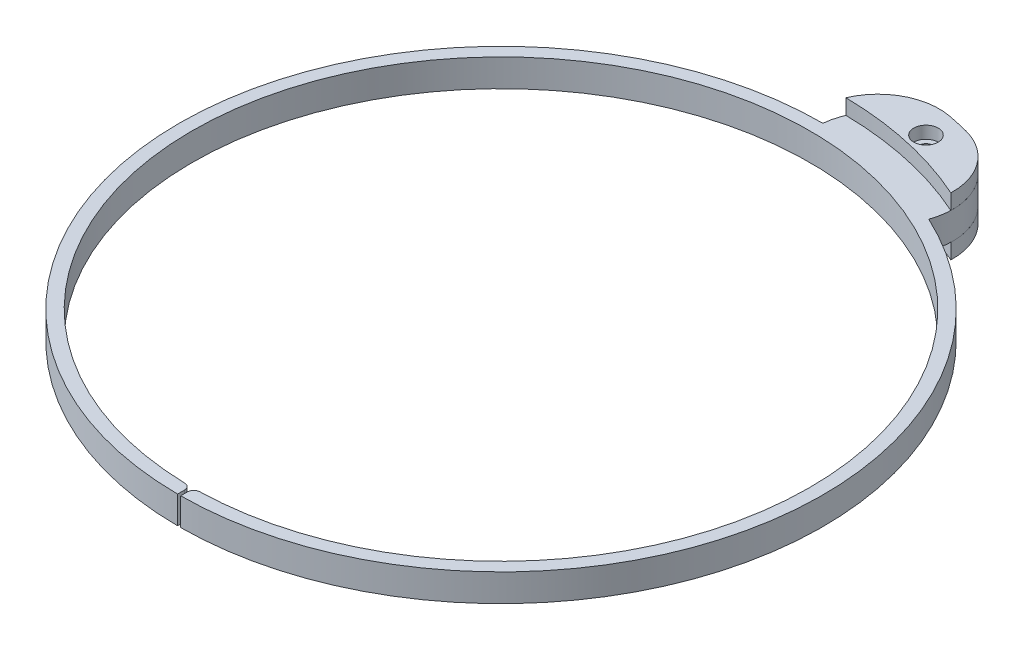
ISO-10303-21;
HEADER;
FILE_DESCRIPTION(('STEP AP214'),'2;1');
FILE_NAME('part.step','',(''),(''),'','','');
FILE_SCHEMA(('AUTOMOTIVE_DESIGN { 1 0 10303 214 1 1 1 1 }'));
ENDSEC;
DATA;
#1=APPLICATION_CONTEXT('core data for automotive mechanical design processes');
#2=APPLICATION_PROTOCOL_DEFINITION('international standard','automotive_design',2000,#1);
#3=PRODUCT_CONTEXT('',#1,'mechanical');
#4=PRODUCT('Part','Part','',(#3));
#5=PRODUCT_RELATED_PRODUCT_CATEGORY('part','',(#4));
#6=PRODUCT_DEFINITION_FORMATION('','',#4);
#7=PRODUCT_DEFINITION_CONTEXT('part definition',#1,'design');
#8=PRODUCT_DEFINITION('design','',#6,#7);
#9=PRODUCT_DEFINITION_SHAPE('','',#8);
#10=(LENGTH_UNIT() NAMED_UNIT(*) SI_UNIT(.MILLI.,.METRE.));
#11=(NAMED_UNIT(*) PLANE_ANGLE_UNIT() SI_UNIT($,.RADIAN.));
#12=(NAMED_UNIT(*) SI_UNIT($,.STERADIAN.) SOLID_ANGLE_UNIT());
#13=UNCERTAINTY_MEASURE_WITH_UNIT(LENGTH_MEASURE(1.E-05),#10,'distance_accuracy_value','');
#14=(GEOMETRIC_REPRESENTATION_CONTEXT(3) GLOBAL_UNCERTAINTY_ASSIGNED_CONTEXT((#13)) GLOBAL_UNIT_ASSIGNED_CONTEXT((#10,
#11,#12)) REPRESENTATION_CONTEXT('',''));
#15=CARTESIAN_POINT('',(0.,0.,0.));
#16=DIRECTION('',(0.,0.,1.));
#17=DIRECTION('',(1.,0.,0.));
#18=AXIS2_PLACEMENT_3D('',#15,#16,#17);
#19=CARTESIAN_POINT('',(0.,9.,0.));
#20=DIRECTION('',(0.,-1.,0.));
#21=DIRECTION('',(0.,0.,-1.));
#22=AXIS2_PLACEMENT_3D('',#19,#20,#21);
#23=CYLINDRICAL_SURFACE('',#22,105.25);
#24=CARTESIAN_POINT('',(0.,9.,0.));
#25=DIRECTION('',(0.,1.,0.));
#26=DIRECTION('',(0.,0.,1.));
#27=AXIS2_PLACEMENT_3D('',#24,#25,#26);
#28=CIRCLE('',#27,105.25);
#29=CARTESIAN_POINT('',(0.500000000000014,9.,105.248812344843));
#30=VERTEX_POINT('',#29);
#31=CARTESIAN_POINT('',(44.4805720482087,9.,-95.3888945856074));
#32=VERTEX_POINT('',#31);
#33=EDGE_CURVE('E171',#30,#32,#28,.T.);
#34=ORIENTED_EDGE('',*,*,#33,.F.);
#35=DIRECTION('',(0.,-1.,0.));
#36=VECTOR('',#35,1.);
#37=CARTESIAN_POINT('',(0.500000000000011,9.,105.248812344843));
#38=LINE('',#37,#36);
#39=CARTESIAN_POINT('',(0.500000000000011,0.,105.248812344843));
#40=VERTEX_POINT('',#39);
#41=EDGE_CURVE('E206',#30,#40,#38,.T.);
#42=ORIENTED_EDGE('',*,*,#41,.T.);
#43=CARTESIAN_POINT('',(0.,0.,0.));
#44=DIRECTION('',(0.,1.,0.));
#45=DIRECTION('',(0.,0.,1.));
#46=AXIS2_PLACEMENT_3D('',#43,#44,#45);
#47=CIRCLE('',#46,105.25);
#48=CARTESIAN_POINT('',(44.4805720482087,0.,-95.3888945856074));
#49=VERTEX_POINT('',#48);
#50=EDGE_CURVE('E184',#40,#49,#47,.T.);
#51=ORIENTED_EDGE('',*,*,#50,.T.);
#52=DIRECTION('',(0.,-1.,0.));
#53=VECTOR('',#52,1.);
#54=CARTESIAN_POINT('',(44.4805720482087,0.,-95.3888945856074));
#55=LINE('',#54,#53);
#56=EDGE_CURVE('E241',#32,#49,#55,.T.);
#57=ORIENTED_EDGE('',*,*,#56,.F.);
#58=EDGE_LOOP('',(#34,#42,#51,#57));
#59=FACE_BOUND('',#58,.T.);
#60=ADVANCED_FACE('F60',(#59),#23,.T.);
#61=CARTESIAN_POINT('',(1.53147339329584,0.,-111.239458328624));
#62=DIRECTION('',(0.,-1.,0.));
#63=DIRECTION('',(0.,0.,-1.));
#64=AXIS2_PLACEMENT_3D('',#61,#62,#63);
#65=PLANE('',#64);
#66=CARTESIAN_POINT('',(0.,0.,0.));
#67=DIRECTION('',(0.,1.,0.));
#68=DIRECTION('',(0.,0.,1.));
#69=AXIS2_PLACEMENT_3D('',#66,#67,#68);
#70=CIRCLE('',#69,101.);
#71=CARTESIAN_POINT('',(2.45145631067962,0.,100.970244933628));
#72=VERTEX_POINT('',#71);
#73=CARTESIAN_POINT('',(-2.4514563106796,0.,100.970244933628));
#74=VERTEX_POINT('',#73);
#75=EDGE_CURVE('E180',#72,#74,#70,.T.);
#76=ORIENTED_EDGE('',*,*,#75,.T.);
#77=CARTESIAN_POINT('',(-2.49999999999999,0.,102.969655724393));
#78=DIRECTION('',(0.,-1.,0.));
#79=DIRECTION('',(0.,0.,-1.));
#80=AXIS2_PLACEMENT_3D('',#77,#78,#79);
#81=CIRCLE('',#80,2.);
#82=CARTESIAN_POINT('',(-0.499999999999989,0.,102.969655724393));
#83=VERTEX_POINT('',#82);
#84=EDGE_CURVE('E69',#74,#83,#81,.T.);
#85=ORIENTED_EDGE('',*,*,#84,.T.);
#86=DIRECTION('',(0.,0.,-1.));
#87=VECTOR('',#86,1.);
#88=CARTESIAN_POINT('',(-0.499999999999989,0.,-111.239458328624));
#89=LINE('',#88,#87);
#90=CARTESIAN_POINT('',(-0.499999999999989,0.,105.248812344843));
#91=VERTEX_POINT('',#90);
#92=EDGE_CURVE('E151',#91,#83,#89,.T.);
#93=ORIENTED_EDGE('',*,*,#92,.F.);
#94=CARTESIAN_POINT('',(0.,0.,-105.25));
#95=VERTEX_POINT('',#94);
#96=EDGE_CURVE('E160',#95,#91,#47,.T.);
#97=ORIENTED_EDGE('',*,*,#96,.F.);
#98=CARTESIAN_POINT('',(19.9095227800857,0.,-103.349762470309));
#99=DIRECTION('',(0.,1.,0.));
#100=DIRECTION('',(0.,0.,1.));
#101=AXIS2_PLACEMENT_3D('',#98,#99,#100);
#102=CIRCLE('',#101,20.);
#103=CARTESIAN_POINT('',(23.6928050185818,0.,-122.988672203384));
#104=VERTEX_POINT('',#103);
#105=EDGE_CURVE('E194',#95,#104,#102,.F.);
#106=ORIENTED_EDGE('',*,*,#105,.T.);
#107=CARTESIAN_POINT('',(0.,0.,0.));
#108=DIRECTION('',(0.,-1.,0.));
#109=DIRECTION('',(0.,0.,-1.));
#110=AXIS2_PLACEMENT_3D('',#107,#108,#109);
#111=CIRCLE('',#110,125.25);
#112=CARTESIAN_POINT('',(30.5042851753092,0.,-121.478603407939));
#113=VERTEX_POINT('',#112);
#114=EDGE_CURVE('E203',#104,#113,#111,.T.);
#115=ORIENTED_EDGE('',*,*,#114,.T.);
#116=CARTESIAN_POINT('',(25.6333414347409,0.,-102.080822424636));
#117=DIRECTION('',(0.,1.,0.));
#118=DIRECTION('',(0.,0.,1.));
#119=AXIS2_PLACEMENT_3D('',#116,#117,#118);
#120=CIRCLE('',#119,20.);
#121=EDGE_CURVE('E190',#113,#49,#120,.F.);
#122=ORIENTED_EDGE('',*,*,#121,.T.);
#123=ORIENTED_EDGE('',*,*,#50,.F.);
#124=DIRECTION('',(0.,0.,1.));
#125=VECTOR('',#124,1.);
#126=CARTESIAN_POINT('',(0.500000000000011,0.,-111.239458328624));
#127=LINE('',#126,#125);
#128=CARTESIAN_POINT('',(0.500000000000011,0.,102.969655724393));
#129=VERTEX_POINT('',#128);
#130=EDGE_CURVE('E256',#129,#40,#127,.T.);
#131=ORIENTED_EDGE('',*,*,#130,.F.);
#132=CARTESIAN_POINT('',(2.50000000000001,0.,102.969655724393));
#133=DIRECTION('',(0.,-1.,0.));
#134=DIRECTION('',(0.,0.,-1.));
#135=AXIS2_PLACEMENT_3D('',#132,#133,#134);
#136=CIRCLE('',#135,2.);
#137=EDGE_CURVE('E76',#129,#72,#136,.T.);
#138=ORIENTED_EDGE('',*,*,#137,.T.);
#139=EDGE_LOOP('',(#76,#85,#93,#97,#106,#115,#122,#123,#131,#138));
#140=FACE_BOUND('',#139,.T.);
#141=CARTESIAN_POINT('',(25.2163460487392,0.,-113.743586553333));
#142=DIRECTION('',(0.,-1.,0.));
#143=DIRECTION('',(0.,0.,-1.));
#144=AXIS2_PLACEMENT_3D('',#141,#142,#143);
#145=CIRCLE('',#144,2.25);
#146=CARTESIAN_POINT('',(25.2163460487392,0.,-115.993586553333));
#147=VERTEX_POINT('',#146);
#148=EDGE_CURVE('E198',#147,#147,#145,.F.);
#149=ORIENTED_EDGE('',*,*,#148,.T.);
#150=EDGE_LOOP('',(#149));
#151=FACE_BOUND('',#150,.T.);
#152=ADVANCED_FACE('F228',(#140,#151),#65,.T.);
#153=CARTESIAN_POINT('',(25.2163460487392,14.,-113.743586553333));
#154=DIRECTION('',(0.,1.,0.));
#155=DIRECTION('',(0.,0.,1.));
#156=AXIS2_PLACEMENT_3D('',#153,#154,#155);
#157=CYLINDRICAL_SURFACE('',#156,2.25);
#158=CARTESIAN_POINT('',(25.2163460487392,9.,-113.743586553333));
#159=DIRECTION('',(0.,1.,0.));
#160=DIRECTION('',(0.,0.,1.));
#161=AXIS2_PLACEMENT_3D('',#158,#159,#160);
#162=CIRCLE('',#161,2.25);
#163=CARTESIAN_POINT('',(25.2163460487392,9.,-111.493586553333));
#164=VERTEX_POINT('',#163);
#165=EDGE_CURVE('E213',#164,#164,#162,.T.);
#166=ORIENTED_EDGE('',*,*,#165,.T.);
#167=EDGE_LOOP('',(#166));
#168=FACE_BOUND('',#167,.T.);
#169=ORIENTED_EDGE('',*,*,#148,.F.);
#170=EDGE_LOOP('',(#169));
#171=FACE_BOUND('',#170,.T.);
#172=ADVANCED_FACE('F273',(#168,#171),#157,.F.);
#173=CARTESIAN_POINT('',(0.,9.,0.));
#174=DIRECTION('',(0.,1.,0.));
#175=DIRECTION('',(0.,0.,1.));
#176=AXIS2_PLACEMENT_3D('',#173,#174,#175);
#177=CYLINDRICAL_SURFACE('',#176,125.25);
#178=ORIENTED_EDGE('',*,*,#114,.F.);
#179=DIRECTION('',(0.,1.,0.));
#180=VECTOR('',#179,1.);
#181=CARTESIAN_POINT('',(23.6928050185818,9.,-122.988672203384));
#182=LINE('',#181,#180);
#183=CARTESIAN_POINT('',(23.6928050185818,9.,-122.988672203384));
#184=VERTEX_POINT('',#183);
#185=EDGE_CURVE('E176',#104,#184,#182,.T.);
#186=ORIENTED_EDGE('',*,*,#185,.T.);
#187=CARTESIAN_POINT('',(0.,9.,0.));
#188=DIRECTION('',(0.,1.,0.));
#189=DIRECTION('',(0.,0.,1.));
#190=AXIS2_PLACEMENT_3D('',#187,#188,#189);
#191=CIRCLE('',#190,125.25);
#192=CARTESIAN_POINT('',(30.5042851753092,9.,-121.478603407939));
#193=VERTEX_POINT('',#192);
#194=EDGE_CURVE('E197',#193,#184,#191,.T.);
#195=ORIENTED_EDGE('',*,*,#194,.F.);
#196=DIRECTION('',(0.,1.,0.));
#197=VECTOR('',#196,1.);
#198=CARTESIAN_POINT('',(30.5042851753092,9.,-121.478603407939));
#199=LINE('',#198,#197);
#200=EDGE_CURVE('E170',#193,#113,#199,.F.);
#201=ORIENTED_EDGE('',*,*,#200,.T.);
#202=EDGE_LOOP('',(#178,#186,#195,#201));
#203=FACE_BOUND('',#202,.T.);
#204=ADVANCED_FACE('F282',(#203),#177,.T.);
#205=CARTESIAN_POINT('',(19.9095227800857,9.,-103.349762470309));
#206=DIRECTION('',(0.,-1.,0.));
#207=DIRECTION('',(0.,0.,-1.));
#208=AXIS2_PLACEMENT_3D('',#205,#206,#207);
#209=CYLINDRICAL_SURFACE('',#208,20.);
#210=ORIENTED_EDGE('',*,*,#185,.F.);
#211=ORIENTED_EDGE('',*,*,#105,.F.);
#212=DIRECTION('',(0.,-1.,0.));
#213=VECTOR('',#212,1.);
#214=CARTESIAN_POINT('',(0.,0.,-105.25));
#215=LINE('',#214,#213);
#216=CARTESIAN_POINT('',(0.,9.,-105.25));
#217=VERTEX_POINT('',#216);
#218=EDGE_CURVE('E202',#217,#95,#215,.T.);
#219=ORIENTED_EDGE('',*,*,#218,.F.);
#220=CARTESIAN_POINT('',(19.9095227800857,9.,-103.349762470309));
#221=DIRECTION('',(0.,1.,0.));
#222=DIRECTION('',(0.,0.,1.));
#223=AXIS2_PLACEMENT_3D('',#220,#221,#222);
#224=CIRCLE('',#223,20.);
#225=EDGE_CURVE('E168',#184,#217,#224,.T.);
#226=ORIENTED_EDGE('',*,*,#225,.F.);
#227=EDGE_LOOP('',(#210,#211,#219,#226));
#228=FACE_BOUND('',#227,.T.);
#229=ADVANCED_FACE('F288',(#228),#209,.T.);
#230=CARTESIAN_POINT('',(25.6333414347409,9.,-102.080822424636));
#231=DIRECTION('',(0.,-1.,0.));
#232=DIRECTION('',(0.,0.,-1.));
#233=AXIS2_PLACEMENT_3D('',#230,#231,#232);
#234=CYLINDRICAL_SURFACE('',#233,20.);
#235=ORIENTED_EDGE('',*,*,#121,.F.);
#236=ORIENTED_EDGE('',*,*,#200,.F.);
#237=CARTESIAN_POINT('',(25.6333414347409,9.,-102.080822424636));
#238=DIRECTION('',(0.,1.,0.));
#239=DIRECTION('',(0.,0.,1.));
#240=AXIS2_PLACEMENT_3D('',#237,#238,#239);
#241=CIRCLE('',#240,20.);
#242=EDGE_CURVE('E185',#32,#193,#241,.T.);
#243=ORIENTED_EDGE('',*,*,#242,.F.);
#244=ORIENTED_EDGE('',*,*,#56,.T.);
#245=EDGE_LOOP('',(#235,#236,#243,#244));
#246=FACE_BOUND('',#245,.T.);
#247=ADVANCED_FACE('F280',(#246),#234,.T.);
#248=CARTESIAN_POINT('',(45.6238402538365,9.,-101.464415932347));
#249=DIRECTION('',(0.,1.,0.));
#250=DIRECTION('',(0.,0.,1.));
#251=AXIS2_PLACEMENT_3D('',#248,#249,#250);
#252=PLANE('',#251);
#253=DIRECTION('',(0.,0.,1.));
#254=VECTOR('',#253,1.);
#255=CARTESIAN_POINT('',(-0.499999999999987,9.,-101.464415932347));
#256=LINE('',#255,#254);
#257=CARTESIAN_POINT('',(-0.499999999999987,9.,102.969655724393));
#258=VERTEX_POINT('',#257);
#259=CARTESIAN_POINT('',(-0.499999999999987,9.,105.248812344843));
#260=VERTEX_POINT('',#259);
#261=EDGE_CURVE('E140',#258,#260,#256,.T.);
#262=ORIENTED_EDGE('',*,*,#261,.F.);
#263=CARTESIAN_POINT('',(-2.49999999999999,9.,102.969655724393));
#264=DIRECTION('',(0.,1.,0.));
#265=DIRECTION('',(0.,0.,1.));
#266=AXIS2_PLACEMENT_3D('',#263,#264,#265);
#267=CIRCLE('',#266,2.);
#268=CARTESIAN_POINT('',(-2.4514563106796,9.,100.970244933628));
#269=VERTEX_POINT('',#268);
#270=EDGE_CURVE('E216',#258,#269,#267,.T.);
#271=ORIENTED_EDGE('',*,*,#270,.T.);
#272=CARTESIAN_POINT('',(0.,9.,0.));
#273=DIRECTION('',(0.,1.,0.));
#274=DIRECTION('',(0.,0.,1.));
#275=AXIS2_PLACEMENT_3D('',#272,#273,#274);
#276=CIRCLE('',#275,101.);
#277=CARTESIAN_POINT('',(2.45145631067962,9.,100.970244933628));
#278=VERTEX_POINT('',#277);
#279=EDGE_CURVE('E235',#278,#269,#276,.T.);
#280=ORIENTED_EDGE('',*,*,#279,.F.);
#281=CARTESIAN_POINT('',(2.50000000000001,9.,102.969655724393));
#282=DIRECTION('',(0.,1.,0.));
#283=DIRECTION('',(0.,0.,1.));
#284=AXIS2_PLACEMENT_3D('',#281,#282,#283);
#285=CIRCLE('',#284,2.);
#286=CARTESIAN_POINT('',(0.500000000000014,9.,102.969655724393));
#287=VERTEX_POINT('',#286);
#288=EDGE_CURVE('E212',#278,#287,#285,.T.);
#289=ORIENTED_EDGE('',*,*,#288,.T.);
#290=DIRECTION('',(0.,0.,-1.));
#291=VECTOR('',#290,1.);
#292=CARTESIAN_POINT('',(0.500000000000014,9.,-101.464415932347));
#293=LINE('',#292,#291);
#294=EDGE_CURVE('E162',#30,#287,#293,.T.);
#295=ORIENTED_EDGE('',*,*,#294,.F.);
#296=ORIENTED_EDGE('',*,*,#33,.T.);
#297=ORIENTED_EDGE('',*,*,#242,.T.);
#298=ORIENTED_EDGE('',*,*,#194,.T.);
#299=ORIENTED_EDGE('',*,*,#225,.T.);
#300=EDGE_CURVE('E157',#217,#260,#28,.T.);
#301=ORIENTED_EDGE('',*,*,#300,.T.);
#302=EDGE_LOOP('',(#262,#271,#280,#289,#295,#296,#297,#298,#299,#301));
#303=FACE_BOUND('',#302,.T.);
#304=ORIENTED_EDGE('',*,*,#165,.F.);
#305=EDGE_LOOP('',(#304));
#306=FACE_BOUND('',#305,.T.);
#307=ADVANCED_FACE('F164',(#303,#306),#252,.T.);
#308=ORIENTED_EDGE('',*,*,#96,.T.);
#309=DIRECTION('',(0.,-1.,0.));
#310=VECTOR('',#309,1.);
#311=CARTESIAN_POINT('',(-0.499999999999989,9.,105.248812344843));
#312=LINE('',#311,#310);
#313=EDGE_CURVE('E144',#91,#260,#312,.F.);
#314=ORIENTED_EDGE('',*,*,#313,.T.);
#315=ORIENTED_EDGE('',*,*,#300,.F.);
#316=ORIENTED_EDGE('',*,*,#218,.T.);
#317=EDGE_LOOP('',(#308,#314,#315,#316));
#318=FACE_BOUND('',#317,.T.);
#319=ADVANCED_FACE('F156',(#318),#23,.T.);
#320=CARTESIAN_POINT('',(0.,9.,0.));
#321=DIRECTION('',(0.,-1.,0.));
#322=DIRECTION('',(0.,0.,-1.));
#323=AXIS2_PLACEMENT_3D('',#320,#321,#322);
#324=CYLINDRICAL_SURFACE('',#323,101.);
#325=ORIENTED_EDGE('',*,*,#279,.T.);
#326=DIRECTION('',(0.,-1.,0.));
#327=VECTOR('',#326,1.);
#328=CARTESIAN_POINT('',(-2.4514563106796,9.,100.970244933628));
#329=LINE('',#328,#327);
#330=EDGE_CURVE('E83',#269,#74,#329,.T.);
#331=ORIENTED_EDGE('',*,*,#330,.T.);
#332=ORIENTED_EDGE('',*,*,#75,.F.);
#333=DIRECTION('',(0.,-1.,0.));
#334=VECTOR('',#333,1.);
#335=CARTESIAN_POINT('',(2.45145631067962,9.,100.970244933628));
#336=LINE('',#335,#334);
#337=EDGE_CURVE('E219',#72,#278,#336,.F.);
#338=ORIENTED_EDGE('',*,*,#337,.T.);
#339=EDGE_LOOP('',(#325,#331,#332,#338));
#340=FACE_BOUND('',#339,.T.);
#341=ADVANCED_FACE('F237',(#340),#324,.F.);
#342=CARTESIAN_POINT('',(-0.499999999999989,-5.,116.112866457982));
#343=DIRECTION('',(-1.,0.,0.));
#344=DIRECTION('',(0.,0.,1.));
#345=AXIS2_PLACEMENT_3D('',#342,#343,#344);
#346=PLANE('',#345);
#347=ORIENTED_EDGE('',*,*,#92,.T.);
#348=DIRECTION('',(0.,1.,0.));
#349=VECTOR('',#348,1.);
#350=CARTESIAN_POINT('',(-0.499999999999989,9.,102.969655724393));
#351=LINE('',#350,#349);
#352=EDGE_CURVE('E147',#83,#258,#351,.T.);
#353=ORIENTED_EDGE('',*,*,#352,.T.);
#354=ORIENTED_EDGE('',*,*,#261,.T.);
#355=ORIENTED_EDGE('',*,*,#313,.F.);
#356=EDGE_LOOP('',(#347,#353,#354,#355));
#357=FACE_BOUND('',#356,.T.);
#358=ADVANCED_FACE('F143',(#357),#346,.F.);
#359=CARTESIAN_POINT('',(0.500000000000011,-5.,116.112866457982));
#360=DIRECTION('',(1.,0.,0.));
#361=DIRECTION('',(0.,0.,-1.));
#362=AXIS2_PLACEMENT_3D('',#359,#360,#361);
#363=PLANE('',#362);
#364=ORIENTED_EDGE('',*,*,#294,.T.);
#365=DIRECTION('',(0.,1.,0.));
#366=VECTOR('',#365,1.);
#367=CARTESIAN_POINT('',(0.500000000000011,0.,102.969655724393));
#368=LINE('',#367,#366);
#369=EDGE_CURVE('E13',#287,#129,#368,.F.);
#370=ORIENTED_EDGE('',*,*,#369,.T.);
#371=ORIENTED_EDGE('',*,*,#130,.T.);
#372=ORIENTED_EDGE('',*,*,#41,.F.);
#373=EDGE_LOOP('',(#364,#370,#371,#372));
#374=FACE_BOUND('',#373,.T.);
#375=ADVANCED_FACE('F263',(#374),#363,.F.);
#376=CARTESIAN_POINT('',(-2.49999999999999,9.,102.969655724393));
#377=DIRECTION('',(0.,-1.,0.));
#378=DIRECTION('',(0.,0.,-1.));
#379=AXIS2_PLACEMENT_3D('',#376,#377,#378);
#380=CYLINDRICAL_SURFACE('',#379,2.);
#381=ORIENTED_EDGE('',*,*,#84,.F.);
#382=ORIENTED_EDGE('',*,*,#330,.F.);
#383=ORIENTED_EDGE('',*,*,#270,.F.);
#384=ORIENTED_EDGE('',*,*,#352,.F.);
#385=EDGE_LOOP('',(#381,#382,#383,#384));
#386=FACE_BOUND('',#385,.T.);
#387=ADVANCED_FACE('F233',(#386),#380,.T.);
#388=CARTESIAN_POINT('',(2.50000000000001,9.,102.969655724393));
#389=DIRECTION('',(0.,-1.,0.));
#390=DIRECTION('',(0.,0.,-1.));
#391=AXIS2_PLACEMENT_3D('',#388,#389,#390);
#392=CYLINDRICAL_SURFACE('',#391,2.);
#393=ORIENTED_EDGE('',*,*,#288,.F.);
#394=ORIENTED_EDGE('',*,*,#337,.F.);
#395=ORIENTED_EDGE('',*,*,#137,.F.);
#396=ORIENTED_EDGE('',*,*,#369,.F.);
#397=EDGE_LOOP('',(#393,#394,#395,#396));
#398=FACE_BOUND('',#397,.T.);
#399=ADVANCED_FACE('F62',(#398),#392,.T.);
#400=CLOSED_SHELL('',(#60,#152,#172,#204,#229,#247,#307,#319,#341,#358,#375,#387,#399));
#401=MANIFOLD_SOLID_BREP('B2',#400);
#402=CARTESIAN_POINT('',(1.53147339329584,0.,-111.239458328624));
#403=DIRECTION('',(0.,-1.,0.));
#404=DIRECTION('',(0.,0.,-1.));
#405=AXIS2_PLACEMENT_3D('',#402,#403,#404);
#406=PLANE('',#405);
#407=CARTESIAN_POINT('',(19.9095227800857,0.,-103.349762470309));
#408=DIRECTION('',(0.,-1.,0.));
#409=DIRECTION('',(0.,0.,-1.));
#410=AXIS2_PLACEMENT_3D('',#407,#408,#409);
#411=CIRCLE('',#410,20.);
#412=CARTESIAN_POINT('',(23.6928050185818,0.,-122.988672203384));
#413=VERTEX_POINT('',#412);
#414=CARTESIAN_POINT('',(1.53147339329584,0.,-111.239458328624));
#415=VERTEX_POINT('',#414);
#416=EDGE_CURVE('E674',#413,#415,#411,.F.);
#417=ORIENTED_EDGE('',*,*,#416,.T.);
#418=CARTESIAN_POINT('',(0.,0.,0.));
#419=DIRECTION('',(0.,-1.,0.));
#420=DIRECTION('',(0.,0.,-1.));
#421=AXIS2_PLACEMENT_3D('',#418,#419,#420);
#422=CIRCLE('',#421,111.25);
#423=CARTESIAN_POINT('',(45.6238402538365,0.,-101.464415932347));
#424=VERTEX_POINT('',#423);
#425=EDGE_CURVE('E58',#415,#424,#422,.T.);
#426=ORIENTED_EDGE('',*,*,#425,.T.);
#427=CARTESIAN_POINT('',(25.6333414347409,0.,-102.080822424636));
#428=DIRECTION('',(0.,-1.,0.));
#429=DIRECTION('',(0.,0.,-1.));
#430=AXIS2_PLACEMENT_3D('',#427,#428,#429);
#431=CIRCLE('',#430,20.);
#432=CARTESIAN_POINT('',(30.5042851753092,0.,-121.478603407939));
#433=VERTEX_POINT('',#432);
#434=EDGE_CURVE('E519',#424,#433,#431,.F.);
#435=ORIENTED_EDGE('',*,*,#434,.T.);
#436=CARTESIAN_POINT('',(0.,0.,0.));
#437=DIRECTION('',(0.,-1.,0.));
#438=DIRECTION('',(0.,0.,-1.));
#439=AXIS2_PLACEMENT_3D('',#436,#437,#438);
#440=CIRCLE('',#439,125.25);
#441=EDGE_CURVE('E670',#413,#433,#440,.T.);
#442=ORIENTED_EDGE('',*,*,#441,.F.);
#443=EDGE_LOOP('',(#417,#426,#435,#442));
#444=FACE_BOUND('',#443,.T.);
#445=CARTESIAN_POINT('',(25.2163460487392,0.,-113.743586553333));
#446=DIRECTION('',(0.,-1.,0.));
#447=DIRECTION('',(0.,0.,-1.));
#448=AXIS2_PLACEMENT_3D('',#445,#446,#447);
#449=CIRCLE('',#448,2.25);
#450=CARTESIAN_POINT('',(25.2163460487392,0.,-115.993586553333));
#451=VERTEX_POINT('',#450);
#452=EDGE_CURVE('E514',#451,#451,#449,.F.);
#453=ORIENTED_EDGE('',*,*,#452,.F.);
#454=EDGE_LOOP('',(#453));
#455=FACE_BOUND('',#454,.T.);
#456=ADVANCED_FACE('F511',(#444,#455),#406,.F.);
#457=CARTESIAN_POINT('',(26.9577188644581,-5.000012,-109.465625117087));
#458=DIRECTION('',(0.13659550707763,0.,-0.990626906280162));
#459=DIRECTION('',(-0.990626906280162,0.,-0.13659550707763));
#460=AXIS2_PLACEMENT_3D('',#457,#458,#459);
#461=PLANE('',#460);
#462=DIRECTION('',(0.,1.,0.));
#463=VECTOR('',#462,1.);
#464=CARTESIAN_POINT('',(22.3822091763994,-5.000012,-110.096532739338));
#465=LINE('',#464,#463);
#466=CARTESIAN_POINT('',(22.3822091763994,-5.,-110.096532739338));
#467=VERTEX_POINT('',#466);
#468=CARTESIAN_POINT('',(22.3822091763994,-2.,-110.096532739338));
#469=VERTEX_POINT('',#468);
#470=EDGE_CURVE('E631',#467,#469,#465,.T.);
#471=ORIENTED_EDGE('',*,*,#470,.T.);
#472=DIRECTION('',(-0.990626906280162,0.,-0.13659550707763));
#473=VECTOR('',#472,1.);
#474=CARTESIAN_POINT('',(26.9577188644581,-2.,-109.465625117087));
#475=LINE('',#474,#473);
#476=CARTESIAN_POINT('',(26.9577188644581,-2.,-109.465625117087));
#477=VERTEX_POINT('',#476);
#478=EDGE_CURVE('E609',#477,#469,#475,.T.);
#479=ORIENTED_EDGE('',*,*,#478,.F.);
#480=DIRECTION('',(0.,1.,0.));
#481=VECTOR('',#480,1.);
#482=CARTESIAN_POINT('',(26.9577188644581,-5.000012,-109.465625117087));
#483=LINE('',#482,#481);
#484=CARTESIAN_POINT('',(26.9577188644581,-5.,-109.465625117087));
#485=VERTEX_POINT('',#484);
#486=EDGE_CURVE('E600',#485,#477,#483,.T.);
#487=ORIENTED_EDGE('',*,*,#486,.F.);
#488=DIRECTION('',(0.990626906280162,0.,0.13659550707763));
#489=VECTOR('',#488,1.);
#490=CARTESIAN_POINT('',(15.3153473522332,-5.,-111.070967784661));
#491=LINE('',#490,#489);
#492=EDGE_CURVE('E664',#467,#485,#491,.T.);
#493=ORIENTED_EDGE('',*,*,#492,.F.);
#494=EDGE_LOOP('',(#471,#479,#487,#493));
#495=FACE_BOUND('',#494,.T.);
#496=ADVANCED_FACE('F683',(#495),#461,.T.);
#497=CARTESIAN_POINT('',(22.3822091763994,-5.000012,-110.096532739338));
#498=DIRECTION('',(0.926205820049823,0.,-0.377018273968033));
#499=DIRECTION('',(-0.377018273968034,0.,-0.926205820049823));
#500=AXIS2_PLACEMENT_3D('',#497,#498,#499);
#501=PLANE('',#500);
#502=DIRECTION('',(0.,1.,0.));
#503=VECTOR('',#502,1.);
#504=CARTESIAN_POINT('',(20.6408363606806,-5.000012,-114.374494175584));
#505=LINE('',#504,#503);
#506=CARTESIAN_POINT('',(20.6408363606806,-5.,-114.374494175584));
#507=VERTEX_POINT('',#506);
#508=CARTESIAN_POINT('',(20.6408363606806,-2.,-114.374494175584));
#509=VERTEX_POINT('',#508);
#510=EDGE_CURVE('E629',#507,#509,#505,.T.);
#511=ORIENTED_EDGE('',*,*,#510,.T.);
#512=DIRECTION('',(-0.377018273968033,0.,-0.926205820049823));
#513=VECTOR('',#512,1.);
#514=CARTESIAN_POINT('',(22.3822091763994,-2.,-110.096532739338));
#515=LINE('',#514,#513);
#516=EDGE_CURVE('E619',#469,#509,#515,.T.);
#517=ORIENTED_EDGE('',*,*,#516,.F.);
#518=ORIENTED_EDGE('',*,*,#470,.F.);
#519=DIRECTION('',(0.377018273968034,0.,0.926205820049823));
#520=VECTOR('',#519,1.);
#521=CARTESIAN_POINT('',(57.6460658201963,-5.,-23.4652166571453));
#522=LINE('',#521,#520);
#523=EDGE_CURVE('E661',#507,#467,#522,.T.);
#524=ORIENTED_EDGE('',*,*,#523,.F.);
#525=EDGE_LOOP('',(#511,#517,#518,#524));
#526=FACE_BOUND('',#525,.T.);
#527=ADVANCED_FACE('F688',(#526),#501,.T.);
#528=CARTESIAN_POINT('',(20.6408363606806,-5.000012,-114.374494175584));
#529=DIRECTION('',(0.78961031297219,0.,0.613608632312127));
#530=DIRECTION('',(0.613608632312127,0.,-0.78961031297219));
#531=AXIS2_PLACEMENT_3D('',#528,#529,#530);
#532=PLANE('',#531);
#533=DIRECTION('',(0.,1.,0.));
#534=VECTOR('',#533,1.);
#535=CARTESIAN_POINT('',(23.4749732330204,-5.000012,-118.021547989579));
#536=LINE('',#535,#534);
#537=CARTESIAN_POINT('',(23.4749732330204,-5.,-118.021547989579));
#538=VERTEX_POINT('',#537);
#539=CARTESIAN_POINT('',(23.4749732330204,-2.,-118.021547989579));
#540=VERTEX_POINT('',#539);
#541=EDGE_CURVE('E627',#538,#540,#536,.T.);
#542=ORIENTED_EDGE('',*,*,#541,.T.);
#543=DIRECTION('',(0.613608632312127,0.,-0.78961031297219));
#544=VECTOR('',#543,1.);
#545=CARTESIAN_POINT('',(20.6408363606806,-2.,-114.374494175584));
#546=LINE('',#545,#544);
#547=EDGE_CURVE('E622',#509,#540,#546,.T.);
#548=ORIENTED_EDGE('',*,*,#547,.F.);
#549=ORIENTED_EDGE('',*,*,#510,.F.);
#550=DIRECTION('',(-0.613608632312127,0.,0.78961031297219));
#551=VECTOR('',#550,1.);
#552=CARTESIAN_POINT('',(-42.5465406597196,-5.,-33.0630491964488));
#553=LINE('',#552,#551);
#554=EDGE_CURVE('E658',#538,#507,#553,.T.);
#555=ORIENTED_EDGE('',*,*,#554,.F.);
#556=EDGE_LOOP('',(#542,#548,#549,#555));
#557=FACE_BOUND('',#556,.T.);
#558=ADVANCED_FACE('F726',(#557),#532,.T.);
#559=CARTESIAN_POINT('',(23.4749732330204,-5.000012,-118.021547989579));
#560=DIRECTION('',(-0.136595507077631,0.,0.990626906280162));
#561=DIRECTION('',(0.990626906280162,0.,0.136595507077631));
#562=AXIS2_PLACEMENT_3D('',#559,#560,#561);
#563=PLANE('',#562);
#564=DIRECTION('',(0.,1.,0.));
#565=VECTOR('',#564,1.);
#566=CARTESIAN_POINT('',(28.0504829210791,-5.000012,-117.390640367328));
#567=LINE('',#566,#565);
#568=CARTESIAN_POINT('',(28.0504829210791,-5.,-117.390640367328));
#569=VERTEX_POINT('',#568);
#570=CARTESIAN_POINT('',(28.0504829210791,-2.,-117.390640367328));
#571=VERTEX_POINT('',#570);
#572=EDGE_CURVE('E625',#569,#571,#567,.T.);
#573=ORIENTED_EDGE('',*,*,#572,.T.);
#574=DIRECTION('',(0.990626906280162,0.,0.136595507077631));
#575=VECTOR('',#574,1.);
#576=CARTESIAN_POINT('',(23.4749732330204,-2.,-118.021547989579));
#577=LINE('',#576,#575);
#578=EDGE_CURVE('E615',#540,#571,#577,.T.);
#579=ORIENTED_EDGE('',*,*,#578,.F.);
#580=ORIENTED_EDGE('',*,*,#541,.F.);
#581=DIRECTION('',(-0.990626906280162,0.,-0.136595507077631));
#582=VECTOR('',#581,1.);
#583=CARTESIAN_POINT('',(16.4081114088544,-5.,-118.995983034902));
#584=LINE('',#583,#582);
#585=EDGE_CURVE('E655',#569,#538,#584,.T.);
#586=ORIENTED_EDGE('',*,*,#585,.F.);
#587=EDGE_LOOP('',(#573,#579,#580,#586));
#588=FACE_BOUND('',#587,.T.);
#589=ADVANCED_FACE('F721',(#588),#563,.T.);
#590=CARTESIAN_POINT('',(28.0504829210791,-5.000012,-117.390640367328));
#591=DIRECTION('',(-0.926205820049823,0.,0.377018273968034));
#592=DIRECTION('',(0.377018273968034,0.,0.926205820049823));
#593=AXIS2_PLACEMENT_3D('',#590,#591,#592);
#594=PLANE('',#593);
#595=DIRECTION('',(0.,1.,0.));
#596=VECTOR('',#595,1.);
#597=CARTESIAN_POINT('',(29.7918557367979,-5.000012,-113.112678931082));
#598=LINE('',#597,#596);
#599=CARTESIAN_POINT('',(29.7918557367979,-5.,-113.112678931082));
#600=VERTEX_POINT('',#599);
#601=CARTESIAN_POINT('',(29.7918557367979,-2.,-113.112678931082));
#602=VERTEX_POINT('',#601);
#603=EDGE_CURVE('E588',#600,#602,#598,.T.);
#604=ORIENTED_EDGE('',*,*,#603,.T.);
#605=DIRECTION('',(0.377018273968034,0.,0.926205820049822));
#606=VECTOR('',#605,1.);
#607=CARTESIAN_POINT('',(28.0504829210791,-2.,-117.390640367328));
#608=LINE('',#607,#606);
#609=EDGE_CURVE('E593',#571,#602,#608,.T.);
#610=ORIENTED_EDGE('',*,*,#609,.F.);
#611=ORIENTED_EDGE('',*,*,#572,.F.);
#612=DIRECTION('',(-0.377018273968034,0.,-0.926205820049823));
#613=VECTOR('',#612,1.);
#614=CARTESIAN_POINT('',(65.055712380595,-5.,-26.4813628488897));
#615=LINE('',#614,#613);
#616=EDGE_CURVE('E596',#600,#569,#615,.T.);
#617=ORIENTED_EDGE('',*,*,#616,.F.);
#618=EDGE_LOOP('',(#604,#610,#611,#617));
#619=FACE_BOUND('',#618,.T.);
#620=ADVANCED_FACE('F590',(#619),#594,.T.);
#621=CARTESIAN_POINT('',(29.7918557367979,-5.000012,-113.112678931082));
#622=DIRECTION('',(-0.789610312972191,0.,-0.613608632312127));
#623=DIRECTION('',(-0.613608632312127,0.,0.789610312972191));
#624=AXIS2_PLACEMENT_3D('',#621,#622,#623);
#625=PLANE('',#624);
#626=ORIENTED_EDGE('',*,*,#486,.T.);
#627=DIRECTION('',(-0.613608632312127,0.,0.789610312972191));
#628=VECTOR('',#627,1.);
#629=CARTESIAN_POINT('',(29.7918557367979,-2.,-113.112678931082));
#630=LINE('',#629,#628);
#631=EDGE_CURVE('E603',#602,#477,#630,.T.);
#632=ORIENTED_EDGE('',*,*,#631,.F.);
#633=ORIENTED_EDGE('',*,*,#603,.F.);
#634=DIRECTION('',(0.613608632312127,0.,-0.789610312972191));
#635=VECTOR('',#634,1.);
#636=CARTESIAN_POINT('',(-36.229658155942,-5.,-28.1541801379517));
#637=LINE('',#636,#635);
#638=EDGE_CURVE('E667',#485,#600,#637,.T.);
#639=ORIENTED_EDGE('',*,*,#638,.F.);
#640=EDGE_LOOP('',(#626,#632,#633,#639));
#641=FACE_BOUND('',#640,.T.);
#642=ADVANCED_FACE('F604',(#641),#625,.T.);
#643=CARTESIAN_POINT('',(0.,9.,0.));
#644=DIRECTION('',(0.,1.,0.));
#645=DIRECTION('',(0.,0.,1.));
#646=AXIS2_PLACEMENT_3D('',#643,#644,#645);
#647=CYLINDRICAL_SURFACE('',#646,125.25);
#648=DIRECTION('',(0.,1.,0.));
#649=VECTOR('',#648,1.);
#650=CARTESIAN_POINT('',(23.6928050185818,9.,-122.988672203384));
#651=LINE('',#650,#649);
#652=CARTESIAN_POINT('',(23.6928050185818,-5.,-122.988672203384));
#653=VERTEX_POINT('',#652);
#654=EDGE_CURVE('E650',#653,#413,#651,.T.);
#655=ORIENTED_EDGE('',*,*,#654,.T.);
#656=ORIENTED_EDGE('',*,*,#441,.T.);
#657=DIRECTION('',(0.,1.,0.));
#658=VECTOR('',#657,1.);
#659=CARTESIAN_POINT('',(30.5042851753092,9.,-121.478603407939));
#660=LINE('',#659,#658);
#661=CARTESIAN_POINT('',(30.5042851753092,-5.,-121.478603407939));
#662=VERTEX_POINT('',#661);
#663=EDGE_CURVE('E653',#433,#662,#660,.F.);
#664=ORIENTED_EDGE('',*,*,#663,.T.);
#665=CARTESIAN_POINT('',(0.,-5.,0.));
#666=DIRECTION('',(0.,-1.,0.));
#667=DIRECTION('',(0.,0.,-1.));
#668=AXIS2_PLACEMENT_3D('',#665,#666,#667);
#669=CIRCLE('',#668,125.25);
#670=EDGE_CURVE('E640',#653,#662,#669,.T.);
#671=ORIENTED_EDGE('',*,*,#670,.F.);
#672=EDGE_LOOP('',(#655,#656,#664,#671));
#673=FACE_BOUND('',#672,.T.);
#674=ADVANCED_FACE('F701',(#673),#647,.T.);
#675=CARTESIAN_POINT('',(25.6333414347409,9.,-102.080822424636));
#676=DIRECTION('',(0.,-1.,0.));
#677=DIRECTION('',(0.,0.,-1.));
#678=AXIS2_PLACEMENT_3D('',#675,#676,#677);
#679=CYLINDRICAL_SURFACE('',#678,20.);
#680=ORIENTED_EDGE('',*,*,#434,.F.);
#681=DIRECTION('',(0.,1.,0.));
#682=VECTOR('',#681,1.);
#683=CARTESIAN_POINT('',(45.6238402538365,-5.,-101.464415932347));
#684=LINE('',#683,#682);
#685=CARTESIAN_POINT('',(45.6238402538365,-5.,-101.464415932347));
#686=VERTEX_POINT('',#685);
#687=EDGE_CURVE('E644',#686,#424,#684,.T.);
#688=ORIENTED_EDGE('',*,*,#687,.F.);
#689=CARTESIAN_POINT('',(25.6333414347409,-5.,-102.080822424636));
#690=DIRECTION('',(0.,-1.,0.));
#691=DIRECTION('',(0.,0.,-1.));
#692=AXIS2_PLACEMENT_3D('',#689,#690,#691);
#693=CIRCLE('',#692,20.);
#694=EDGE_CURVE('E643',#662,#686,#693,.T.);
#695=ORIENTED_EDGE('',*,*,#694,.F.);
#696=ORIENTED_EDGE('',*,*,#663,.F.);
#697=EDGE_LOOP('',(#680,#688,#695,#696));
#698=FACE_BOUND('',#697,.T.);
#699=ADVANCED_FACE('F704',(#698),#679,.T.);
#700=CARTESIAN_POINT('',(0.,-5.,0.));
#701=DIRECTION('',(0.,-1.,0.));
#702=DIRECTION('',(0.,0.,-1.));
#703=AXIS2_PLACEMENT_3D('',#700,#701,#702);
#704=PLANE('',#703);
#705=CARTESIAN_POINT('',(0.,-5.,0.));
#706=DIRECTION('',(0.,-1.,0.));
#707=DIRECTION('',(0.,0.,-1.));
#708=AXIS2_PLACEMENT_3D('',#705,#706,#707);
#709=CIRCLE('',#708,111.25);
#710=CARTESIAN_POINT('',(1.53147339329584,-5.,-111.239458328624));
#711=VERTEX_POINT('',#710);
#712=EDGE_CURVE('E634',#711,#686,#709,.T.);
#713=ORIENTED_EDGE('',*,*,#712,.F.);
#714=CARTESIAN_POINT('',(19.9095227800857,-5.,-103.349762470309));
#715=DIRECTION('',(0.,-1.,0.));
#716=DIRECTION('',(0.,0.,-1.));
#717=AXIS2_PLACEMENT_3D('',#714,#715,#716);
#718=CIRCLE('',#717,20.);
#719=EDGE_CURVE('E637',#711,#653,#718,.T.);
#720=ORIENTED_EDGE('',*,*,#719,.T.);
#721=ORIENTED_EDGE('',*,*,#670,.T.);
#722=ORIENTED_EDGE('',*,*,#694,.T.);
#723=EDGE_LOOP('',(#713,#720,#721,#722));
#724=FACE_BOUND('',#723,.T.);
#725=ORIENTED_EDGE('',*,*,#638,.T.);
#726=ORIENTED_EDGE('',*,*,#616,.T.);
#727=ORIENTED_EDGE('',*,*,#585,.T.);
#728=ORIENTED_EDGE('',*,*,#554,.T.);
#729=ORIENTED_EDGE('',*,*,#523,.T.);
#730=ORIENTED_EDGE('',*,*,#492,.T.);
#731=EDGE_LOOP('',(#725,#726,#727,#728,#729,#730));
#732=FACE_BOUND('',#731,.T.);
#733=ADVANCED_FACE('F707',(#724,#732),#704,.T.);
#734=CARTESIAN_POINT('',(19.9095227800857,9.,-103.349762470309));
#735=DIRECTION('',(0.,-1.,0.));
#736=DIRECTION('',(0.,0.,-1.));
#737=AXIS2_PLACEMENT_3D('',#734,#735,#736);
#738=CYLINDRICAL_SURFACE('',#737,20.);
#739=ORIENTED_EDGE('',*,*,#416,.F.);
#740=ORIENTED_EDGE('',*,*,#654,.F.);
#741=ORIENTED_EDGE('',*,*,#719,.F.);
#742=DIRECTION('',(0.,1.,0.));
#743=VECTOR('',#742,1.);
#744=CARTESIAN_POINT('',(1.53147339329584,-5.,-111.239458328624));
#745=LINE('',#744,#743);
#746=EDGE_CURVE('E647',#711,#415,#745,.T.);
#747=ORIENTED_EDGE('',*,*,#746,.T.);
#748=EDGE_LOOP('',(#739,#740,#741,#747));
#749=FACE_BOUND('',#748,.T.);
#750=ADVANCED_FACE('F705',(#749),#738,.T.);
#751=CARTESIAN_POINT('',(0.,-5.,0.));
#752=DIRECTION('',(0.,1.,0.));
#753=DIRECTION('',(0.,0.,1.));
#754=AXIS2_PLACEMENT_3D('',#751,#752,#753);
#755=CYLINDRICAL_SURFACE('',#754,111.25);
#756=ORIENTED_EDGE('',*,*,#425,.F.);
#757=ORIENTED_EDGE('',*,*,#746,.F.);
#758=ORIENTED_EDGE('',*,*,#712,.T.);
#759=ORIENTED_EDGE('',*,*,#687,.T.);
#760=EDGE_LOOP('',(#756,#757,#758,#759));
#761=FACE_BOUND('',#760,.T.);
#762=ADVANCED_FACE('F696',(#761),#755,.F.);
#763=CARTESIAN_POINT('',(0.,-2.,0.));
#764=DIRECTION('',(0.,-1.,0.));
#765=DIRECTION('',(0.,0.,-1.));
#766=AXIS2_PLACEMENT_3D('',#763,#764,#765);
#767=PLANE('',#766);
#768=ORIENTED_EDGE('',*,*,#609,.T.);
#769=ORIENTED_EDGE('',*,*,#631,.T.);
#770=ORIENTED_EDGE('',*,*,#478,.T.);
#771=ORIENTED_EDGE('',*,*,#516,.T.);
#772=ORIENTED_EDGE('',*,*,#547,.T.);
#773=ORIENTED_EDGE('',*,*,#578,.T.);
#774=EDGE_LOOP('',(#768,#769,#770,#771,#772,#773));
#775=FACE_BOUND('',#774,.T.);
#776=CARTESIAN_POINT('',(25.2163460487392,-2.,-113.743586553333));
#777=DIRECTION('',(0.,-1.,0.));
#778=DIRECTION('',(0.,0.,-1.));
#779=AXIS2_PLACEMENT_3D('',#776,#777,#778);
#780=CIRCLE('',#779,2.25);
#781=CARTESIAN_POINT('',(25.2163460487392,-2.,-115.993586553333));
#782=VERTEX_POINT('',#781);
#783=EDGE_CURVE('E599',#782,#782,#780,.F.);
#784=ORIENTED_EDGE('',*,*,#783,.T.);
#785=EDGE_LOOP('',(#784));
#786=FACE_BOUND('',#785,.T.);
#787=ADVANCED_FACE('F611',(#775,#786),#767,.T.);
#788=CARTESIAN_POINT('',(25.2163460487392,14.,-113.743586553333));
#789=DIRECTION('',(0.,1.,0.));
#790=DIRECTION('',(0.,0.,1.));
#791=AXIS2_PLACEMENT_3D('',#788,#789,#790);
#792=CYLINDRICAL_SURFACE('',#791,2.25);
#793=ORIENTED_EDGE('',*,*,#452,.T.);
#794=EDGE_LOOP('',(#793));
#795=FACE_BOUND('',#794,.T.);
#796=ORIENTED_EDGE('',*,*,#783,.F.);
#797=EDGE_LOOP('',(#796));
#798=FACE_BOUND('',#797,.T.);
#799=ADVANCED_FACE('F679',(#795,#798),#792,.F.);
#800=CLOSED_SHELL('',(#456,#496,#527,#558,#589,#620,#642,#674,#699,#733,#750,#762,#787,#799));
#801=MANIFOLD_SOLID_BREP('B7',#800);
#802=CARTESIAN_POINT('',(45.6238402538365,9.,-101.464415932347));
#803=DIRECTION('',(0.,1.,0.));
#804=DIRECTION('',(0.,0.,1.));
#805=AXIS2_PLACEMENT_3D('',#802,#803,#804);
#806=PLANE('',#805);
#807=CARTESIAN_POINT('',(25.2163460487392,9.,-113.743586553333));
#808=DIRECTION('',(0.,1.,0.));
#809=DIRECTION('',(0.,0.,1.));
#810=AXIS2_PLACEMENT_3D('',#807,#808,#809);
#811=CIRCLE('',#810,2.25);
#812=CARTESIAN_POINT('',(25.2163460487392,9.,-111.493586553333));
#813=VERTEX_POINT('',#812);
#814=EDGE_CURVE('E928',#813,#813,#811,.T.);
#815=ORIENTED_EDGE('',*,*,#814,.T.);
#816=EDGE_LOOP('',(#815));
#817=FACE_BOUND('',#816,.T.);
#818=CARTESIAN_POINT('',(25.6333414347409,9.,-102.080822424636));
#819=DIRECTION('',(0.,1.,0.));
#820=DIRECTION('',(0.,0.,1.));
#821=AXIS2_PLACEMENT_3D('',#818,#819,#820);
#822=CIRCLE('',#821,20.);
#823=CARTESIAN_POINT('',(30.5042851753092,9.,-121.478603407939));
#824=VERTEX_POINT('',#823);
#825=CARTESIAN_POINT('',(45.6238402538365,9.,-101.464415932347));
#826=VERTEX_POINT('',#825);
#827=EDGE_CURVE('E933',#824,#826,#822,.F.);
#828=ORIENTED_EDGE('',*,*,#827,.T.);
#829=CARTESIAN_POINT('',(0.,9.,0.));
#830=DIRECTION('',(0.,1.,0.));
#831=DIRECTION('',(0.,0.,1.));
#832=AXIS2_PLACEMENT_3D('',#829,#830,#831);
#833=CIRCLE('',#832,111.25);
#834=CARTESIAN_POINT('',(1.53147339329584,9.,-111.239458328624));
#835=VERTEX_POINT('',#834);
#836=EDGE_CURVE('E509',#826,#835,#833,.T.);
#837=ORIENTED_EDGE('',*,*,#836,.T.);
#838=CARTESIAN_POINT('',(19.9095227800857,9.,-103.349762470309));
#839=DIRECTION('',(0.,1.,0.));
#840=DIRECTION('',(0.,0.,1.));
#841=AXIS2_PLACEMENT_3D('',#838,#839,#840);
#842=CIRCLE('',#841,20.);
#843=CARTESIAN_POINT('',(23.6928050185818,9.,-122.988672203384));
#844=VERTEX_POINT('',#843);
#845=EDGE_CURVE('E947',#835,#844,#842,.F.);
#846=ORIENTED_EDGE('',*,*,#845,.T.);
#847=CARTESIAN_POINT('',(0.,9.,0.));
#848=DIRECTION('',(0.,1.,0.));
#849=DIRECTION('',(0.,0.,1.));
#850=AXIS2_PLACEMENT_3D('',#847,#848,#849);
#851=CIRCLE('',#850,125.25);
#852=EDGE_CURVE('E1000',#824,#844,#851,.T.);
#853=ORIENTED_EDGE('',*,*,#852,.F.);
#854=EDGE_LOOP('',(#828,#837,#846,#853));
#855=FACE_BOUND('',#854,.T.);
#856=ADVANCED_FACE('F925',(#817,#855),#806,.F.);
#857=CARTESIAN_POINT('',(0.,9.,0.));
#858=DIRECTION('',(0.,1.,0.));
#859=DIRECTION('',(0.,0.,1.));
#860=AXIS2_PLACEMENT_3D('',#857,#858,#859);
#861=CYLINDRICAL_SURFACE('',#860,125.25);
#862=DIRECTION('',(0.,1.,0.));
#863=VECTOR('',#862,1.);
#864=CARTESIAN_POINT('',(30.5042851753092,9.,-121.478603407939));
#865=LINE('',#864,#863);
#866=CARTESIAN_POINT('',(30.5042851753092,14.,-121.478603407939));
#867=VERTEX_POINT('',#866);
#868=EDGE_CURVE('E973',#867,#824,#865,.F.);
#869=ORIENTED_EDGE('',*,*,#868,.T.);
#870=ORIENTED_EDGE('',*,*,#852,.T.);
#871=DIRECTION('',(0.,1.,0.));
#872=VECTOR('',#871,1.);
#873=CARTESIAN_POINT('',(23.6928050185818,9.,-122.988672203384));
#874=LINE('',#873,#872);
#875=CARTESIAN_POINT('',(23.6928050185818,14.,-122.988672203384));
#876=VERTEX_POINT('',#875);
#877=EDGE_CURVE('E998',#844,#876,#874,.T.);
#878=ORIENTED_EDGE('',*,*,#877,.T.);
#879=CARTESIAN_POINT('',(0.,14.,0.));
#880=DIRECTION('',(0.,1.,0.));
#881=DIRECTION('',(0.,0.,1.));
#882=AXIS2_PLACEMENT_3D('',#879,#880,#881);
#883=CIRCLE('',#882,125.25);
#884=EDGE_CURVE('E983',#867,#876,#883,.T.);
#885=ORIENTED_EDGE('',*,*,#884,.F.);
#886=EDGE_LOOP('',(#869,#870,#878,#885));
#887=FACE_BOUND('',#886,.T.);
#888=ADVANCED_FACE('F1003',(#887),#861,.T.);
#889=CARTESIAN_POINT('',(19.9095227800857,9.,-103.349762470309));
#890=DIRECTION('',(0.,-1.,0.));
#891=DIRECTION('',(0.,0.,-1.));
#892=AXIS2_PLACEMENT_3D('',#889,#890,#891);
#893=CYLINDRICAL_SURFACE('',#892,20.);
#894=ORIENTED_EDGE('',*,*,#845,.F.);
#895=DIRECTION('',(0.,-1.,0.));
#896=VECTOR('',#895,1.);
#897=CARTESIAN_POINT('',(1.53147339329584,14.,-111.239458328624));
#898=LINE('',#897,#896);
#899=CARTESIAN_POINT('',(1.53147339329584,14.,-111.239458328624));
#900=VERTEX_POINT('',#899);
#901=EDGE_CURVE('E974',#900,#835,#898,.T.);
#902=ORIENTED_EDGE('',*,*,#901,.F.);
#903=CARTESIAN_POINT('',(19.9095227800857,14.,-103.349762470309));
#904=DIRECTION('',(0.,1.,0.));
#905=DIRECTION('',(0.,0.,1.));
#906=AXIS2_PLACEMENT_3D('',#903,#904,#905);
#907=CIRCLE('',#906,20.);
#908=EDGE_CURVE('E987',#876,#900,#907,.T.);
#909=ORIENTED_EDGE('',*,*,#908,.F.);
#910=ORIENTED_EDGE('',*,*,#877,.F.);
#911=EDGE_LOOP('',(#894,#902,#909,#910));
#912=FACE_BOUND('',#911,.T.);
#913=ADVANCED_FACE('F1005',(#912),#893,.T.);
#914=CARTESIAN_POINT('',(0.,14.,0.));
#915=DIRECTION('',(0.,1.,0.));
#916=DIRECTION('',(0.,0.,1.));
#917=AXIS2_PLACEMENT_3D('',#914,#915,#916);
#918=PLANE('',#917);
#919=CARTESIAN_POINT('',(25.2163460487392,14.,-113.743586553333));
#920=DIRECTION('',(0.,1.,0.));
#921=DIRECTION('',(0.,0.,1.));
#922=AXIS2_PLACEMENT_3D('',#919,#920,#921);
#923=CIRCLE('',#922,3.99999999999999);
#924=CARTESIAN_POINT('',(25.2163460487392,14.,-109.743586553333));
#925=VERTEX_POINT('',#924);
#926=EDGE_CURVE('E1044',#925,#925,#923,.T.);
#927=ORIENTED_EDGE('',*,*,#926,.F.);
#928=EDGE_LOOP('',(#927));
#929=FACE_BOUND('',#928,.T.);
#930=CARTESIAN_POINT('',(0.,14.,0.));
#931=DIRECTION('',(0.,1.,0.));
#932=DIRECTION('',(0.,0.,1.));
#933=AXIS2_PLACEMENT_3D('',#930,#931,#932);
#934=CIRCLE('',#933,111.25);
#935=CARTESIAN_POINT('',(45.6238402538365,14.,-101.464415932347));
#936=VERTEX_POINT('',#935);
#937=EDGE_CURVE('E970',#936,#900,#934,.T.);
#938=ORIENTED_EDGE('',*,*,#937,.F.);
#939=CARTESIAN_POINT('',(25.6333414347409,14.,-102.080822424636));
#940=DIRECTION('',(0.,1.,0.));
#941=DIRECTION('',(0.,0.,1.));
#942=AXIS2_PLACEMENT_3D('',#939,#940,#941);
#943=CIRCLE('',#942,20.);
#944=EDGE_CURVE('E977',#936,#867,#943,.T.);
#945=ORIENTED_EDGE('',*,*,#944,.T.);
#946=ORIENTED_EDGE('',*,*,#884,.T.);
#947=ORIENTED_EDGE('',*,*,#908,.T.);
#948=EDGE_LOOP('',(#938,#945,#946,#947));
#949=FACE_BOUND('',#948,.T.);
#950=ADVANCED_FACE('F985',(#929,#949),#918,.T.);
#951=CARTESIAN_POINT('',(25.6333414347409,9.,-102.080822424636));
#952=DIRECTION('',(0.,-1.,0.));
#953=DIRECTION('',(0.,0.,-1.));
#954=AXIS2_PLACEMENT_3D('',#951,#952,#953);
#955=CYLINDRICAL_SURFACE('',#954,20.);
#956=ORIENTED_EDGE('',*,*,#827,.F.);
#957=ORIENTED_EDGE('',*,*,#868,.F.);
#958=ORIENTED_EDGE('',*,*,#944,.F.);
#959=DIRECTION('',(0.,-1.,0.));
#960=VECTOR('',#959,1.);
#961=CARTESIAN_POINT('',(45.6238402538365,14.,-101.464415932347));
#962=LINE('',#961,#960);
#963=EDGE_CURVE('E966',#936,#826,#962,.T.);
#964=ORIENTED_EDGE('',*,*,#963,.T.);
#965=EDGE_LOOP('',(#956,#957,#958,#964));
#966=FACE_BOUND('',#965,.T.);
#967=ADVANCED_FACE('F978',(#966),#955,.T.);
#968=CARTESIAN_POINT('',(0.,14.,0.));
#969=DIRECTION('',(0.,-1.,0.));
#970=DIRECTION('',(0.,0.,-1.));
#971=AXIS2_PLACEMENT_3D('',#968,#969,#970);
#972=CYLINDRICAL_SURFACE('',#971,111.25);
#973=ORIENTED_EDGE('',*,*,#836,.F.);
#974=ORIENTED_EDGE('',*,*,#963,.F.);
#975=ORIENTED_EDGE('',*,*,#937,.T.);
#976=ORIENTED_EDGE('',*,*,#901,.T.);
#977=EDGE_LOOP('',(#973,#974,#975,#976));
#978=FACE_BOUND('',#977,.T.);
#979=ADVANCED_FACE('F968',(#978),#972,.F.);
#980=CARTESIAN_POINT('',(25.2163460487392,14.,-113.743586553333));
#981=DIRECTION('',(0.,1.,0.));
#982=DIRECTION('',(0.,0.,1.));
#983=AXIS2_PLACEMENT_3D('',#980,#981,#982);
#984=CYLINDRICAL_SURFACE('',#983,2.25);
#985=CARTESIAN_POINT('',(25.2163460487392,10.,-113.743586553333));
#986=DIRECTION('',(0.,1.,0.));
#987=DIRECTION('',(0.,0.,1.));
#988=AXIS2_PLACEMENT_3D('',#985,#986,#987);
#989=CIRCLE('',#988,2.25);
#990=CARTESIAN_POINT('',(25.2163460487392,10.,-111.493586553333));
#991=VERTEX_POINT('',#990);
#992=EDGE_CURVE('E990',#991,#991,#989,.T.);
#993=ORIENTED_EDGE('',*,*,#992,.T.);
#994=EDGE_LOOP('',(#993));
#995=FACE_BOUND('',#994,.T.);
#996=ORIENTED_EDGE('',*,*,#814,.F.);
#997=EDGE_LOOP('',(#996));
#998=FACE_BOUND('',#997,.T.);
#999=ADVANCED_FACE('F1015',(#995,#998),#984,.F.);
#1000=CARTESIAN_POINT('',(27.4663460487392,10.,-113.743586553333));
#1001=DIRECTION('',(0.,-1.,0.));
#1002=DIRECTION('',(0.,0.,-1.));
#1003=AXIS2_PLACEMENT_3D('',#1000,#1001,#1002);
#1004=PLANE('',#1003);
#1005=ORIENTED_EDGE('',*,*,#992,.F.);
#1006=EDGE_LOOP('',(#1005));
#1007=FACE_BOUND('',#1006,.T.);
#1008=CARTESIAN_POINT('',(25.2163460487392,10.,-113.743586553333));
#1009=DIRECTION('',(0.,1.,0.));
#1010=DIRECTION('',(0.,0.,1.));
#1011=AXIS2_PLACEMENT_3D('',#1008,#1009,#1010);
#1012=CIRCLE('',#1011,4.);
#1013=CARTESIAN_POINT('',(25.2163460487392,10.,-109.743586553333));
#1014=VERTEX_POINT('',#1013);
#1015=EDGE_CURVE('E1041',#1014,#1014,#1012,.T.);
#1016=ORIENTED_EDGE('',*,*,#1015,.T.);
#1017=EDGE_LOOP('',(#1016));
#1018=FACE_BOUND('',#1017,.T.);
#1019=ADVANCED_FACE('F1026',(#1007,#1018),#1004,.F.);
#1020=CARTESIAN_POINT('',(25.2163460487392,14.,-113.743586553333));
#1021=DIRECTION('',(0.,1.,0.));
#1022=DIRECTION('',(0.,0.,1.));
#1023=AXIS2_PLACEMENT_3D('',#1020,#1021,#1022);
#1024=CYLINDRICAL_SURFACE('',#1023,3.99999999999999);
#1025=ORIENTED_EDGE('',*,*,#1015,.F.);
#1026=EDGE_LOOP('',(#1025));
#1027=FACE_BOUND('',#1026,.T.);
#1028=ORIENTED_EDGE('',*,*,#926,.T.);
#1029=EDGE_LOOP('',(#1028));
#1030=FACE_BOUND('',#1029,.T.);
#1031=ADVANCED_FACE('F1032',(#1027,#1030),#1024,.F.);
#1032=CLOSED_SHELL('',(#856,#888,#913,#950,#967,#979,#999,#1019,#1031));
#1033=MANIFOLD_SOLID_BREP('B52',#1032);
#1034=ADVANCED_BREP_SHAPE_REPRESENTATION('',(#18,#401,#801,#1033),#14);
#1035=SHAPE_DEFINITION_REPRESENTATION(#9,#1034);
ENDSEC;
END-ISO-10303-21;
